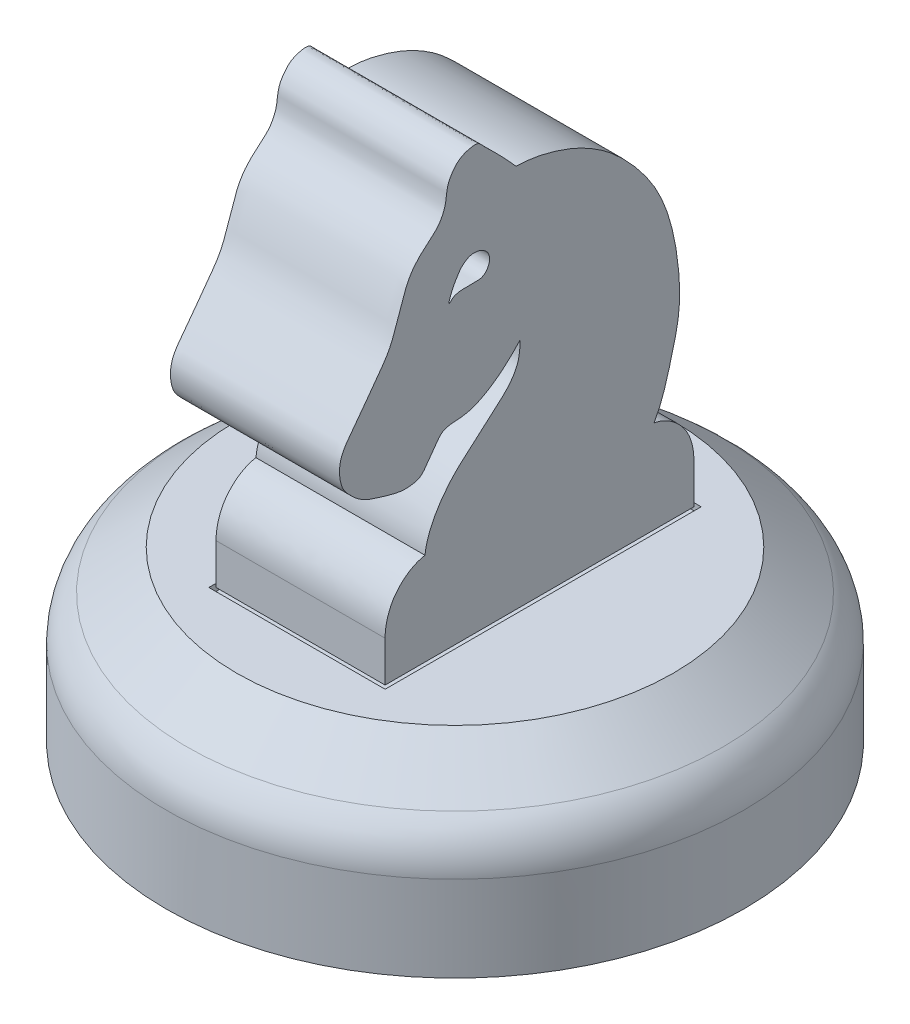
ISO-10303-21;
HEADER;
FILE_DESCRIPTION(('STEP AP214'),'2;1');
FILE_NAME('part.step','',(''),(''),'','','');
FILE_SCHEMA(('AUTOMOTIVE_DESIGN { 1 0 10303 214 1 1 1 1 }'));
ENDSEC;
DATA;
#1=APPLICATION_CONTEXT('core data for automotive mechanical design processes');
#2=APPLICATION_PROTOCOL_DEFINITION('international standard','automotive_design',2000,#1);
#3=PRODUCT_CONTEXT('',#1,'mechanical');
#4=PRODUCT('Part','Part','',(#3));
#5=PRODUCT_RELATED_PRODUCT_CATEGORY('part','',(#4));
#6=PRODUCT_DEFINITION_FORMATION('','',#4);
#7=PRODUCT_DEFINITION_CONTEXT('part definition',#1,'design');
#8=PRODUCT_DEFINITION('design','',#6,#7);
#9=PRODUCT_DEFINITION_SHAPE('','',#8);
#10=(LENGTH_UNIT() NAMED_UNIT(*) SI_UNIT(.MILLI.,.METRE.));
#11=(NAMED_UNIT(*) PLANE_ANGLE_UNIT() SI_UNIT($,.RADIAN.));
#12=(NAMED_UNIT(*) SI_UNIT($,.STERADIAN.) SOLID_ANGLE_UNIT());
#13=UNCERTAINTY_MEASURE_WITH_UNIT(LENGTH_MEASURE(1.E-05),#10,'distance_accuracy_value','');
#14=(GEOMETRIC_REPRESENTATION_CONTEXT(3) GLOBAL_UNCERTAINTY_ASSIGNED_CONTEXT((#13)) GLOBAL_UNIT_ASSIGNED_CONTEXT((#10,
#11,#12)) REPRESENTATION_CONTEXT('',''));
#15=CARTESIAN_POINT('',(0.,0.,0.));
#16=DIRECTION('',(0.,0.,1.));
#17=DIRECTION('',(1.,0.,0.));
#18=AXIS2_PLACEMENT_3D('',#15,#16,#17);
#19=CARTESIAN_POINT('',(4.7625,13.680262783567,8.10185735939134));
#20=DIRECTION('',(1.,0.,0.));
#21=DIRECTION('',(0.,0.,-1.));
#22=AXIS2_PLACEMENT_3D('',#19,#20,#21);
#23=PLANE('',#22);
#24=DIRECTION('',(0.,-1.,0.));
#25=VECTOR('',#24,1.);
#26=CARTESIAN_POINT('',(4.7625,9.525,8.6995));
#27=LINE('',#26,#25);
#28=CARTESIAN_POINT('',(4.7625,11.811,8.6995));
#29=VERTEX_POINT('',#28);
#30=CARTESIAN_POINT('',(4.7625,9.525,8.6995));
#31=VERTEX_POINT('',#30);
#32=EDGE_CURVE('E188',#29,#31,#27,.T.);
#33=ORIENTED_EDGE('',*,*,#32,.T.);
#34=DIRECTION('',(0.,0.,-1.));
#35=VECTOR('',#34,1.);
#36=CARTESIAN_POINT('',(4.7625,9.525,8.6995));
#37=LINE('',#36,#35);
#38=CARTESIAN_POINT('',(4.7625,9.525,-8.6995));
#39=VERTEX_POINT('',#38);
#40=EDGE_CURVE('E107',#31,#39,#37,.T.);
#41=ORIENTED_EDGE('',*,*,#40,.T.);
#42=DIRECTION('',(0.,1.,0.));
#43=VECTOR('',#42,1.);
#44=CARTESIAN_POINT('',(4.7625,9.525,-8.6995));
#45=LINE('',#44,#43);
#46=CARTESIAN_POINT('',(4.7625,11.811,-8.6995));
#47=VERTEX_POINT('',#46);
#48=EDGE_CURVE('E182',#39,#47,#45,.T.);
#49=ORIENTED_EDGE('',*,*,#48,.T.);
#50=CARTESIAN_POINT('',(4.7625,11.811,-8.6995));
#51=CARTESIAN_POINT('',(4.7625,11.9815961923143,-8.6995));
#52=CARTESIAN_POINT('',(4.7625,12.3664028911852,-8.67268212158395));
#53=CARTESIAN_POINT('',(4.7625,12.9064775592162,-8.52854866214895));
#54=CARTESIAN_POINT('',(4.7625,13.451955456764,-8.28386065244339));
#55=CARTESIAN_POINT('',(4.7625,14.2087504776773,-7.70489167117968));
#56=CARTESIAN_POINT('',(4.7625,14.6403347608002,-7.02156279420086));
#57=CARTESIAN_POINT('',(4.7625,14.7379537831052,-6.45515120216595));
#58=B_SPLINE_CURVE_WITH_KNOTS('',3,(#50,#51,#52,#53,#54,#55,#56,#57),.UNSPECIFIED.,.F.,.F.,(4,1,
1,1,1,4),(0.,0.128233990164805,0.288855325655213,0.417856800573254,0.575529242566264,1.),.UNSPECIFIED.);
#59=CARTESIAN_POINT('',(4.7625,14.7379537831052,-6.45515120216595));
#60=VERTEX_POINT('',#59);
#61=EDGE_CURVE('E174',#47,#60,#58,.T.);
#62=ORIENTED_EDGE('',*,*,#61,.T.);
#63=CARTESIAN_POINT('',(4.7625,14.7379537831052,-6.45515120216595));
#64=CARTESIAN_POINT('',(4.7625,15.5347916018253,-6.9072620120768));
#65=CARTESIAN_POINT('',(4.7625,17.1101019740375,-7.34079514012189));
#66=CARTESIAN_POINT('',(4.7625,19.4480811595958,-7.96599147797506));
#67=CARTESIAN_POINT('',(4.7625,21.5772855386648,-7.86645750943055));
#68=CARTESIAN_POINT('',(4.7625,23.4518934582812,-7.56723246801266));
#69=CARTESIAN_POINT('',(4.7625,24.986345257311,-7.11555121839741));
#70=CARTESIAN_POINT('',(4.7625,26.4436945704068,-6.41887229237447));
#71=CARTESIAN_POINT('',(4.7625,27.8375203593776,-5.37923603258682));
#72=CARTESIAN_POINT('',(4.7625,29.2202358296838,-4.02108903850162));
#73=CARTESIAN_POINT('',(4.7625,30.2418776267701,-2.42109382286231));
#74=CARTESIAN_POINT('',(4.7625,30.9170736598921,-0.615022309664148));
#75=CARTESIAN_POINT('',(4.7625,31.1431076052662,0.631432852208959));
#76=CARTESIAN_POINT('',(4.7625,31.1487973226437,1.31786095725713));
#77=B_SPLINE_CURVE_WITH_KNOTS('',3,(#63,#64,#65,#66,#67,#68,#69,#70,#71,#72,#73,#74,#75,#76),
.UNSPECIFIED.,.F.,.F.,(4,1,1,1,1,1,1,1,1,1,1,4),(0.,0.126007373067254,0.227672467983957,
0.334593320710156,0.419280454598045,0.491973595792967,0.556390973249089,0.643086331897103,
0.732789512617551,0.824947916326929,0.904682993600365,1.),.UNSPECIFIED.);
#78=CARTESIAN_POINT('',(4.7625,31.1487973226437,1.31786095725713));
#79=VERTEX_POINT('',#78);
#80=EDGE_CURVE('E126',#60,#79,#77,.T.);
#81=ORIENTED_EDGE('',*,*,#80,.T.);
#82=CARTESIAN_POINT('',(4.7625,31.1487973226437,1.31786095725713));
#83=CARTESIAN_POINT('',(4.7625,31.3019539348354,1.45730049804001));
#84=CARTESIAN_POINT('',(4.7625,31.5916483646961,1.71945064919034));
#85=CARTESIAN_POINT('',(4.7625,32.0339251377226,2.12254258440014));
#86=CARTESIAN_POINT('',(4.7625,32.4196440870442,2.52092241210094));
#87=CARTESIAN_POINT('',(4.7625,32.7987952576809,2.89165676870557));
#88=CARTESIAN_POINT('',(4.7625,33.0718995845694,3.18261460187202));
#89=CARTESIAN_POINT('',(4.7625,33.3918119300108,3.45651904952485));
#90=CARTESIAN_POINT('',(4.7625,33.3460595804598,3.85969832162765));
#91=CARTESIAN_POINT('',(4.7625,33.2406253004543,4.22418115934891));
#92=CARTESIAN_POINT('',(4.7625,33.0714744992397,4.56187923221866));
#93=CARTESIAN_POINT('',(4.7625,32.7397376417843,4.85282466889233));
#94=CARTESIAN_POINT('',(4.7625,32.3233214539465,5.13371688084466));
#95=CARTESIAN_POINT('',(4.7625,31.7778308318256,5.2492641494817));
#96=CARTESIAN_POINT('',(4.7625,31.2653014281355,5.28305110750728));
#97=CARTESIAN_POINT('',(4.7625,30.8254634824363,5.46526160709992));
#98=CARTESIAN_POINT('',(4.7625,30.4120679447406,5.69606919114635));
#99=CARTESIAN_POINT('',(4.7625,30.0233837216251,6.13198260016487));
#100=CARTESIAN_POINT('',(4.7625,29.58447749268,6.66656239494976));
#101=CARTESIAN_POINT('',(4.7625,29.0694104150552,7.13500986450126));
#102=CARTESIAN_POINT('',(4.7625,28.4591601352961,7.49196972547366));
#103=CARTESIAN_POINT('',(4.7625,27.6783731865673,7.75326363201573));
#104=CARTESIAN_POINT('',(4.7625,26.7447160773661,8.0786048897184));
#105=CARTESIAN_POINT('',(4.7625,25.6576345659822,8.47293069308954));
#106=CARTESIAN_POINT('',(4.7625,24.60695120243,9.27769962639));
#107=CARTESIAN_POINT('',(4.7625,23.6433822269488,9.95593836350496));
#108=CARTESIAN_POINT('',(4.7625,22.7146203346543,10.670082220103));
#109=CARTESIAN_POINT('',(4.7625,21.8693039695622,11.309327348714));
#110=CARTESIAN_POINT('',(4.7625,20.8989819068334,11.2884547003213));
#111=CARTESIAN_POINT('',(4.7625,20.2218415586761,11.0741872670407));
#112=CARTESIAN_POINT('',(4.7625,19.8212324440838,10.7307904437454));
#113=CARTESIAN_POINT('',(4.7625,19.3936747980264,10.2834904058553));
#114=CARTESIAN_POINT('',(4.7625,19.0533612219154,9.7160877020694));
#115=CARTESIAN_POINT('',(4.7625,18.8258930334863,8.99799387422308));
#116=CARTESIAN_POINT('',(4.7625,18.653276271082,8.38900127299677));
#117=CARTESIAN_POINT('',(4.7625,18.5080892643669,7.74067788544095));
#118=CARTESIAN_POINT('',(4.7625,18.5167644688039,7.26091311616883));
#119=CARTESIAN_POINT('',(4.7625,18.6203424372546,6.84307431844907));
#120=CARTESIAN_POINT('',(4.7625,18.7688583852471,6.62521992602052));
#121=CARTESIAN_POINT('',(4.7625,18.9784827417534,6.44718649876644));
#122=CARTESIAN_POINT('',(4.7625,19.276534866618,6.25139804487029));
#123=CARTESIAN_POINT('',(4.7625,19.5888657127173,6.03115202876769));
#124=CARTESIAN_POINT('',(4.7625,19.9439760955313,5.77397263662202));
#125=CARTESIAN_POINT('',(4.7625,20.2863734926147,5.50734482016748));
#126=CARTESIAN_POINT('',(4.7625,20.4245643735899,5.02198912619642));
#127=CARTESIAN_POINT('',(4.7625,20.4241354600657,4.45032303542215));
#128=CARTESIAN_POINT('',(4.7625,20.5658541445792,3.75446304575918));
#129=CARTESIAN_POINT('',(4.7625,20.8927489051511,3.08791812469143));
#130=CARTESIAN_POINT('',(4.7625,21.4895068352595,2.15763469778238));
#131=CARTESIAN_POINT('',(4.7625,22.095248332157,1.52424191195429));
#132=CARTESIAN_POINT('',(4.7625,22.5542260915944,1.10611662472741));
#133=B_SPLINE_CURVE_WITH_KNOTS('',3,(#82,#83,#84,#85,#86,#87,#88,#89,#90,#91,#92,#93,#94,#95,
#96,#97,#98,#99,#100,#101,#102,#103,#104,#105,#106,#107,#108,#109,#110,#111,#112,#113,#114,#115,
#116,#117,#118,#119,#120,#121,#122,#123,#124,#125,#126,#127,#128,#129,#130,#131,#132),
.UNSPECIFIED.,.F.,.F.,(4,1,1,1,1,1,1,1,1,1,1,1,1,1,1,1,1,1,1,1,1,1,1,1,1,1,1,1,1,1,1,1,1,1,1,1,
1,1,1,1,1,1,1,1,1,1,1,1,4),(0.,0.0200285013306857,0.0378013132698523,0.0578347683022131,
0.0737149460717673,0.0888621925596499,0.0970547922181342,0.112617960896865,0.123059195197901,
0.134757664060357,0.148235409207326,0.165302201936764,0.182701414375231,0.201371334421468,
0.214662711055314,0.228355299492923,0.246798942162103,0.270468225403544,0.295484215537379,
0.313575639667433,0.338434845961959,0.374813003705989,0.409524434716514,0.449363327622569,
0.501847178188648,0.523473875222212,0.563305662334159,0.600627468565589,0.611504704924638,
0.631603453699679,0.650438857968825,0.671472559329384,0.694788305552869,0.72306459099666,
0.732740737033354,0.758962592426231,0.768667896917222,0.773745680506905,0.784195553559758,
0.79498839276868,0.808300877575605,0.821026305357643,0.837861595072931,0.848300254108209,
0.868397558300759,0.893257253257513,0.916056330819442,0.939814835257287,1.),.UNSPECIFIED.);
#134=CARTESIAN_POINT('',(4.7625,22.5542260915944,1.10611662472741));
#135=VERTEX_POINT('',#134);
#136=EDGE_CURVE('E120',#79,#135,#133,.T.);
#137=ORIENTED_EDGE('',*,*,#136,.T.);
#138=CARTESIAN_POINT('',(4.7625,22.5542260915944,1.10611662472741));
#139=CARTESIAN_POINT('',(4.7625,22.2131253799065,1.09648964800483));
#140=CARTESIAN_POINT('',(4.7625,21.6496468955946,1.12638893104751));
#141=CARTESIAN_POINT('',(4.7625,20.9781166465928,1.47595846530786));
#142=CARTESIAN_POINT('',(4.7625,20.3939968393132,1.94038289383728));
#143=CARTESIAN_POINT('',(4.7625,19.6923521136648,2.77931915192104));
#144=CARTESIAN_POINT('',(4.7625,18.8940429093478,3.66084665280636));
#145=CARTESIAN_POINT('',(4.7625,17.8972255421681,4.84281215205144));
#146=CARTESIAN_POINT('',(4.7625,16.6148240678941,5.88737462386131));
#147=CARTESIAN_POINT('',(4.7625,15.3671193281076,6.3837177201072));
#148=CARTESIAN_POINT('',(4.7625,14.7379537831052,6.45515120216595));
#149=B_SPLINE_CURVE_WITH_KNOTS('',3,(#138,#139,#140,#141,#142,#143,#144,#145,#146,#147,#148),
.UNSPECIFIED.,.F.,.F.,(4,1,1,1,1,1,1,1,4),(0.,0.105970750134368,0.167070244546414,
0.229152258300758,0.333775591942745,0.501080945363479,0.594140792573538,0.807741902537396,1.),.UNSPECIFIED.);
#150=CARTESIAN_POINT('',(4.7625,14.7379537831052,6.45515120216595));
#151=VERTEX_POINT('',#150);
#152=EDGE_CURVE('E124',#135,#151,#149,.T.);
#153=ORIENTED_EDGE('',*,*,#152,.T.);
#154=CARTESIAN_POINT('',(4.7625,14.7379537831052,6.45515120216595));
#155=CARTESIAN_POINT('',(4.7625,14.6403347608002,7.02156279420086));
#156=CARTESIAN_POINT('',(4.7625,14.2087504776772,7.70489167117969));
#157=CARTESIAN_POINT('',(4.7625,13.451955456764,8.28386065244339));
#158=CARTESIAN_POINT('',(4.7625,12.9064775592162,8.52854866214895));
#159=CARTESIAN_POINT('',(4.7625,12.3664028911852,8.67268212158395));
#160=CARTESIAN_POINT('',(4.7625,11.9815961923143,8.6995));
#161=CARTESIAN_POINT('',(4.7625,11.811,8.6995));
#162=B_SPLINE_CURVE_WITH_KNOTS('',3,(#154,#155,#156,#157,#158,#159,#160,#161),.UNSPECIFIED.,.F.,
.F.,(4,1,1,1,1,4),(0.,0.424470757433736,0.582143199426746,0.711144674344787,0.871766009835195,
1.),.UNSPECIFIED.);
#163=EDGE_CURVE('E64',#151,#29,#162,.T.);
#164=ORIENTED_EDGE('',*,*,#163,.T.);
#165=EDGE_LOOP('',(#33,#41,#49,#62,#81,#137,#153,#164));
#166=FACE_BOUND('',#165,.T.);
#167=CARTESIAN_POINT('',(4.7625,26.3388988766511,5.08617017560119));
#168=CARTESIAN_POINT('',(4.7625,26.3483995760784,5.05185816319176));
#169=CARTESIAN_POINT('',(4.7625,26.4831045083582,4.93271466574575));
#170=CARTESIAN_POINT('',(4.7625,26.5840300403057,4.7483450621545));
#171=CARTESIAN_POINT('',(4.7625,26.662879880077,4.42967293283595));
#172=CARTESIAN_POINT('',(4.7625,26.6412567644405,4.02395765693448));
#173=CARTESIAN_POINT('',(4.7625,26.6460619243882,3.63395203071275));
#174=CARTESIAN_POINT('',(4.7625,26.6568112403724,3.32276074456051));
#175=CARTESIAN_POINT('',(4.7625,26.7717474415305,3.08688608467086));
#176=CARTESIAN_POINT('',(4.7625,26.9604273950743,2.93579771919843));
#177=CARTESIAN_POINT('',(4.7625,27.1671363718712,2.82667940769507));
#178=CARTESIAN_POINT('',(4.7625,27.411587188444,2.80113211917649));
#179=CARTESIAN_POINT('',(4.7625,27.6537811085069,2.85307486280875));
#180=CARTESIAN_POINT('',(4.7625,27.8429114567317,3.00066030420355));
#181=CARTESIAN_POINT('',(4.7625,27.9888023740051,3.1767734058697));
#182=CARTESIAN_POINT('',(4.7625,28.0789963178476,3.39949872033269));
#183=CARTESIAN_POINT('',(4.7625,28.1164637771991,3.65127377386429));
#184=CARTESIAN_POINT('',(4.7625,28.0897034965547,3.94412895023011));
#185=CARTESIAN_POINT('',(4.7625,27.9337546783365,4.21099239793935));
#186=CARTESIAN_POINT('',(4.7625,27.7278682510043,4.44499410641345));
#187=CARTESIAN_POINT('',(4.7625,27.460033775197,4.61845709624444));
#188=CARTESIAN_POINT('',(4.7625,27.1345838269302,4.8162389271877));
#189=CARTESIAN_POINT('',(4.7625,26.8493073414952,4.95570050393066));
#190=CARTESIAN_POINT('',(4.7625,26.3208648740321,5.15130042484097));
#191=CARTESIAN_POINT('',(4.7625,26.3388988766511,5.08617017560119));
#192=B_SPLINE_CURVE_WITH_KNOTS('',3,(#167,#168,#169,#170,#171,#172,#173,#174,#175,#176,#177,
#178,#179,#180,#181,#182,#183,#184,#185,#186,#187,#188,#189,#190,#191),.UNSPECIFIED.,.T.,.F.,(4,
1,1,1,1,1,1,1,1,1,1,1,1,1,1,1,1,1,1,1,1,1,4),(0.,0.0376761457665458,0.0555163401210343,
0.103904133388575,0.184310142197023,0.245367846033381,0.285824881718788,0.328299460197946,
0.362294770441984,0.397084060775239,0.435791870679061,0.474404445258391,0.509262158340571,
0.54539207058665,0.579953507985603,0.619659858056652,0.663361880045701,0.713892917119672,
0.760702485225998,0.807081634789745,0.863624654351297,0.928484032504755,1.),.UNSPECIFIED.);
#193=CARTESIAN_POINT('',(4.7625,26.3388988766511,5.08617017560119));
#194=VERTEX_POINT('',#193);
#195=EDGE_CURVE('E195',#194,#194,#192,.T.);
#196=ORIENTED_EDGE('',*,*,#195,.F.);
#197=EDGE_LOOP('',(#196));
#198=FACE_BOUND('',#197,.T.);
#199=ADVANCED_FACE('F47',(#166,#198),#23,.T.);
#200=CARTESIAN_POINT('',(-4.7625,13.680262783567,8.10185735939134));
#201=DIRECTION('',(1.,0.,0.));
#202=DIRECTION('',(0.,0.,-1.));
#203=AXIS2_PLACEMENT_3D('',#200,#201,#202);
#204=PLANE('',#203);
#205=DIRECTION('',(0.,-1.,0.));
#206=VECTOR('',#205,1.);
#207=CARTESIAN_POINT('',(-4.7625,9.525,8.6995));
#208=LINE('',#207,#206);
#209=CARTESIAN_POINT('',(-4.7625,11.811,8.6995));
#210=VERTEX_POINT('',#209);
#211=CARTESIAN_POINT('',(-4.7625,9.525,8.6995));
#212=VERTEX_POINT('',#211);
#213=EDGE_CURVE('E203',#210,#212,#208,.T.);
#214=ORIENTED_EDGE('',*,*,#213,.F.);
#215=CARTESIAN_POINT('',(-4.7625,14.7379537831052,6.45515120216595));
#216=CARTESIAN_POINT('',(-4.7625,14.6403347608002,7.02156279420086));
#217=CARTESIAN_POINT('',(-4.7625,14.2087504776772,7.70489167117969));
#218=CARTESIAN_POINT('',(-4.7625,13.451955456764,8.28386065244339));
#219=CARTESIAN_POINT('',(-4.7625,12.9064775592162,8.52854866214895));
#220=CARTESIAN_POINT('',(-4.7625,12.3664028911852,8.67268212158395));
#221=CARTESIAN_POINT('',(-4.7625,11.9815961923143,8.6995));
#222=CARTESIAN_POINT('',(-4.7625,11.811,8.6995));
#223=B_SPLINE_CURVE_WITH_KNOTS('',3,(#215,#216,#217,#218,#219,#220,#221,#222),.UNSPECIFIED.,.F.,
.F.,(4,1,1,1,1,4),(0.,0.424470757433736,0.582143199426746,0.711144674344787,0.871766009835195,
1.),.UNSPECIFIED.);
#224=CARTESIAN_POINT('',(-4.7625,14.7379537831052,6.45515120216595));
#225=VERTEX_POINT('',#224);
#226=EDGE_CURVE('E99',#225,#210,#223,.T.);
#227=ORIENTED_EDGE('',*,*,#226,.F.);
#228=CARTESIAN_POINT('',(-4.7625,22.5542260915944,1.10611662472741));
#229=CARTESIAN_POINT('',(-4.7625,22.2131253799065,1.09648964800483));
#230=CARTESIAN_POINT('',(-4.7625,21.6496468955946,1.12638893104751));
#231=CARTESIAN_POINT('',(-4.7625,20.9781166465928,1.47595846530786));
#232=CARTESIAN_POINT('',(-4.7625,20.3939968393132,1.94038289383728));
#233=CARTESIAN_POINT('',(-4.7625,19.6923521136648,2.77931915192104));
#234=CARTESIAN_POINT('',(-4.7625,18.8940429093478,3.66084665280636));
#235=CARTESIAN_POINT('',(-4.7625,17.8972255421681,4.84281215205144));
#236=CARTESIAN_POINT('',(-4.7625,16.6148240678941,5.88737462386131));
#237=CARTESIAN_POINT('',(-4.7625,15.3671193281076,6.3837177201072));
#238=CARTESIAN_POINT('',(-4.7625,14.7379537831052,6.45515120216595));
#239=B_SPLINE_CURVE_WITH_KNOTS('',3,(#228,#229,#230,#231,#232,#233,#234,#235,#236,#237,#238),
.UNSPECIFIED.,.F.,.F.,(4,1,1,1,1,1,1,1,4),(0.,0.105970750134368,0.167070244546414,
0.229152258300758,0.333775591942745,0.501080945363479,0.594140792573538,0.807741902537396,1.),.UNSPECIFIED.);
#240=CARTESIAN_POINT('',(-4.7625,22.5542260915944,1.10611662472741));
#241=VERTEX_POINT('',#240);
#242=EDGE_CURVE('E93',#241,#225,#239,.T.);
#243=ORIENTED_EDGE('',*,*,#242,.F.);
#244=CARTESIAN_POINT('',(-4.7625,31.1487973226437,1.31786095725713));
#245=CARTESIAN_POINT('',(-4.7625,31.3019539348354,1.45730049804001));
#246=CARTESIAN_POINT('',(-4.7625,31.5916483646961,1.71945064919034));
#247=CARTESIAN_POINT('',(-4.7625,32.0339251377226,2.12254258440014));
#248=CARTESIAN_POINT('',(-4.7625,32.4196440870442,2.52092241210094));
#249=CARTESIAN_POINT('',(-4.7625,32.7987952576809,2.89165676870557));
#250=CARTESIAN_POINT('',(-4.7625,33.0718995845694,3.18261460187202));
#251=CARTESIAN_POINT('',(-4.7625,33.3918119300108,3.45651904952485));
#252=CARTESIAN_POINT('',(-4.7625,33.3460595804598,3.85969832162765));
#253=CARTESIAN_POINT('',(-4.7625,33.2406253004543,4.22418115934891));
#254=CARTESIAN_POINT('',(-4.7625,33.0714744992397,4.56187923221866));
#255=CARTESIAN_POINT('',(-4.7625,32.7397376417843,4.85282466889233));
#256=CARTESIAN_POINT('',(-4.7625,32.3233214539465,5.13371688084466));
#257=CARTESIAN_POINT('',(-4.7625,31.7778308318256,5.2492641494817));
#258=CARTESIAN_POINT('',(-4.7625,31.2653014281355,5.28305110750728));
#259=CARTESIAN_POINT('',(-4.7625,30.8254634824363,5.46526160709992));
#260=CARTESIAN_POINT('',(-4.7625,30.4120679447406,5.69606919114635));
#261=CARTESIAN_POINT('',(-4.7625,30.0233837216251,6.13198260016487));
#262=CARTESIAN_POINT('',(-4.7625,29.58447749268,6.66656239494976));
#263=CARTESIAN_POINT('',(-4.7625,29.0694104150552,7.13500986450126));
#264=CARTESIAN_POINT('',(-4.7625,28.4591601352961,7.49196972547366));
#265=CARTESIAN_POINT('',(-4.7625,27.6783731865673,7.75326363201573));
#266=CARTESIAN_POINT('',(-4.7625,26.7447160773661,8.0786048897184));
#267=CARTESIAN_POINT('',(-4.7625,25.6576345659822,8.47293069308954));
#268=CARTESIAN_POINT('',(-4.7625,24.60695120243,9.27769962639));
#269=CARTESIAN_POINT('',(-4.7625,23.6433822269488,9.95593836350496));
#270=CARTESIAN_POINT('',(-4.7625,22.7146203346543,10.670082220103));
#271=CARTESIAN_POINT('',(-4.7625,21.8693039695622,11.309327348714));
#272=CARTESIAN_POINT('',(-4.7625,20.8989819068334,11.2884547003213));
#273=CARTESIAN_POINT('',(-4.7625,20.2218415586761,11.0741872670407));
#274=CARTESIAN_POINT('',(-4.7625,19.8212324440838,10.7307904437454));
#275=CARTESIAN_POINT('',(-4.7625,19.3936747980264,10.2834904058553));
#276=CARTESIAN_POINT('',(-4.7625,19.0533612219154,9.7160877020694));
#277=CARTESIAN_POINT('',(-4.7625,18.8258930334863,8.99799387422308));
#278=CARTESIAN_POINT('',(-4.7625,18.653276271082,8.38900127299677));
#279=CARTESIAN_POINT('',(-4.7625,18.5080892643669,7.74067788544095));
#280=CARTESIAN_POINT('',(-4.7625,18.5167644688039,7.26091311616883));
#281=CARTESIAN_POINT('',(-4.7625,18.6203424372546,6.84307431844907));
#282=CARTESIAN_POINT('',(-4.7625,18.7688583852471,6.62521992602052));
#283=CARTESIAN_POINT('',(-4.7625,18.9784827417534,6.44718649876644));
#284=CARTESIAN_POINT('',(-4.7625,19.276534866618,6.25139804487029));
#285=CARTESIAN_POINT('',(-4.7625,19.5888657127173,6.03115202876769));
#286=CARTESIAN_POINT('',(-4.7625,19.9439760955313,5.77397263662202));
#287=CARTESIAN_POINT('',(-4.7625,20.2863734926147,5.50734482016748));
#288=CARTESIAN_POINT('',(-4.7625,20.4245643735899,5.02198912619642));
#289=CARTESIAN_POINT('',(-4.7625,20.4241354600657,4.45032303542215));
#290=CARTESIAN_POINT('',(-4.7625,20.5658541445792,3.75446304575918));
#291=CARTESIAN_POINT('',(-4.7625,20.8927489051511,3.08791812469143));
#292=CARTESIAN_POINT('',(-4.7625,21.4895068352595,2.15763469778238));
#293=CARTESIAN_POINT('',(-4.7625,22.095248332157,1.52424191195429));
#294=CARTESIAN_POINT('',(-4.7625,22.5542260915944,1.10611662472741));
#295=B_SPLINE_CURVE_WITH_KNOTS('',3,(#244,#245,#246,#247,#248,#249,#250,#251,#252,#253,#254,
#255,#256,#257,#258,#259,#260,#261,#262,#263,#264,#265,#266,#267,#268,#269,#270,#271,#272,#273,
#274,#275,#276,#277,#278,#279,#280,#281,#282,#283,#284,#285,#286,#287,#288,#289,#290,#291,#292,
#293,#294),.UNSPECIFIED.,.F.,.F.,(4,1,1,1,1,1,1,1,1,1,1,1,1,1,1,1,1,1,1,1,1,1,1,1,1,1,1,1,1,1,1,
1,1,1,1,1,1,1,1,1,1,1,1,1,1,1,1,1,4),(0.,0.0200285013306857,0.0378013132698523,
0.0578347683022131,0.0737149460717673,0.0888621925596499,0.0970547922181342,0.112617960896865,
0.123059195197901,0.134757664060357,0.148235409207326,0.165302201936764,0.182701414375231,
0.201371334421468,0.214662711055314,0.228355299492923,0.246798942162103,0.270468225403544,
0.295484215537379,0.313575639667433,0.338434845961959,0.374813003705989,0.409524434716514,
0.449363327622569,0.501847178188648,0.523473875222212,0.563305662334159,0.600627468565589,
0.611504704924638,0.631603453699679,0.650438857968825,0.671472559329384,0.694788305552869,
0.72306459099666,0.732740737033354,0.758962592426231,0.768667896917222,0.773745680506905,
0.784195553559758,0.79498839276868,0.808300877575605,0.821026305357643,0.837861595072931,
0.848300254108209,0.868397558300759,0.893257253257513,0.916056330819442,0.939814835257287,1.),.UNSPECIFIED.);
#296=CARTESIAN_POINT('',(-4.7625,31.1487973226437,1.31786095725713));
#297=VERTEX_POINT('',#296);
#298=EDGE_CURVE('E134',#297,#241,#295,.T.);
#299=ORIENTED_EDGE('',*,*,#298,.F.);
#300=CARTESIAN_POINT('',(-4.7625,14.7379537831052,-6.45515120216595));
#301=CARTESIAN_POINT('',(-4.7625,15.5347916018253,-6.9072620120768));
#302=CARTESIAN_POINT('',(-4.7625,17.1101019740375,-7.34079514012189));
#303=CARTESIAN_POINT('',(-4.7625,19.4480811595958,-7.96599147797506));
#304=CARTESIAN_POINT('',(-4.7625,21.5772855386648,-7.86645750943055));
#305=CARTESIAN_POINT('',(-4.7625,23.4518934582812,-7.56723246801266));
#306=CARTESIAN_POINT('',(-4.7625,24.986345257311,-7.11555121839741));
#307=CARTESIAN_POINT('',(-4.7625,26.4436945704068,-6.41887229237447));
#308=CARTESIAN_POINT('',(-4.7625,27.8375203593776,-5.37923603258682));
#309=CARTESIAN_POINT('',(-4.7625,29.2202358296838,-4.02108903850162));
#310=CARTESIAN_POINT('',(-4.7625,30.2418776267701,-2.42109382286231));
#311=CARTESIAN_POINT('',(-4.7625,30.9170736598921,-0.615022309664148));
#312=CARTESIAN_POINT('',(-4.7625,31.1431076052662,0.631432852208959));
#313=CARTESIAN_POINT('',(-4.7625,31.1487973226437,1.31786095725713));
#314=B_SPLINE_CURVE_WITH_KNOTS('',3,(#300,#301,#302,#303,#304,#305,#306,#307,#308,#309,#310,
#311,#312,#313),.UNSPECIFIED.,.F.,.F.,(4,1,1,1,1,1,1,1,1,1,1,4),(0.,0.126007373067254,
0.227672467983957,0.334593320710156,0.419280454598045,0.491973595792967,0.556390973249089,
0.643086331897103,0.732789512617551,0.824947916326929,0.904682993600365,1.),.UNSPECIFIED.);
#315=CARTESIAN_POINT('',(-4.7625,14.7379537831052,-6.45515120216595));
#316=VERTEX_POINT('',#315);
#317=EDGE_CURVE('E237',#316,#297,#314,.T.);
#318=ORIENTED_EDGE('',*,*,#317,.F.);
#319=CARTESIAN_POINT('',(-4.7625,11.811,-8.6995));
#320=CARTESIAN_POINT('',(-4.7625,11.9815961923143,-8.6995));
#321=CARTESIAN_POINT('',(-4.7625,12.3664028911852,-8.67268212158395));
#322=CARTESIAN_POINT('',(-4.7625,12.9064775592162,-8.52854866214895));
#323=CARTESIAN_POINT('',(-4.7625,13.451955456764,-8.28386065244339));
#324=CARTESIAN_POINT('',(-4.7625,14.2087504776773,-7.70489167117968));
#325=CARTESIAN_POINT('',(-4.7625,14.6403347608002,-7.02156279420086));
#326=CARTESIAN_POINT('',(-4.7625,14.7379537831052,-6.45515120216595));
#327=B_SPLINE_CURVE_WITH_KNOTS('',3,(#319,#320,#321,#322,#323,#324,#325,#326),.UNSPECIFIED.,.F.,
.F.,(4,1,1,1,1,4),(0.,0.128233990164805,0.288855325655213,0.417856800573254,0.575529242566264,
1.),.UNSPECIFIED.);
#328=CARTESIAN_POINT('',(-4.7625,11.811,-8.6995));
#329=VERTEX_POINT('',#328);
#330=EDGE_CURVE('E233',#329,#316,#327,.T.);
#331=ORIENTED_EDGE('',*,*,#330,.F.);
#332=DIRECTION('',(0.,1.,0.));
#333=VECTOR('',#332,1.);
#334=CARTESIAN_POINT('',(-4.7625,9.525,-8.6995));
#335=LINE('',#334,#333);
#336=CARTESIAN_POINT('',(-4.7625,9.525,-8.6995));
#337=VERTEX_POINT('',#336);
#338=EDGE_CURVE('E229',#337,#329,#335,.T.);
#339=ORIENTED_EDGE('',*,*,#338,.F.);
#340=DIRECTION('',(0.,0.,-1.));
#341=VECTOR('',#340,1.);
#342=CARTESIAN_POINT('',(-4.7625,9.525,8.6995));
#343=LINE('',#342,#341);
#344=EDGE_CURVE('E227',#212,#337,#343,.T.);
#345=ORIENTED_EDGE('',*,*,#344,.F.);
#346=EDGE_LOOP('',(#214,#227,#243,#299,#318,#331,#339,#345));
#347=FACE_BOUND('',#346,.T.);
#348=CARTESIAN_POINT('',(-4.7625,26.3388988766511,5.08617017560119));
#349=CARTESIAN_POINT('',(-4.7625,26.3483995760784,5.05185816319176));
#350=CARTESIAN_POINT('',(-4.7625,26.4831045083582,4.93271466574575));
#351=CARTESIAN_POINT('',(-4.7625,26.5840300403057,4.7483450621545));
#352=CARTESIAN_POINT('',(-4.7625,26.662879880077,4.42967293283595));
#353=CARTESIAN_POINT('',(-4.7625,26.6412567644405,4.02395765693448));
#354=CARTESIAN_POINT('',(-4.7625,26.6460619243882,3.63395203071275));
#355=CARTESIAN_POINT('',(-4.7625,26.6568112403724,3.32276074456051));
#356=CARTESIAN_POINT('',(-4.7625,26.7717474415305,3.08688608467086));
#357=CARTESIAN_POINT('',(-4.7625,26.9604273950743,2.93579771919843));
#358=CARTESIAN_POINT('',(-4.7625,27.1671363718712,2.82667940769507));
#359=CARTESIAN_POINT('',(-4.7625,27.411587188444,2.80113211917649));
#360=CARTESIAN_POINT('',(-4.7625,27.6537811085069,2.85307486280875));
#361=CARTESIAN_POINT('',(-4.7625,27.8429114567317,3.00066030420355));
#362=CARTESIAN_POINT('',(-4.7625,27.9888023740051,3.1767734058697));
#363=CARTESIAN_POINT('',(-4.7625,28.0789963178476,3.39949872033269));
#364=CARTESIAN_POINT('',(-4.7625,28.1164637771991,3.65127377386429));
#365=CARTESIAN_POINT('',(-4.7625,28.0897034965547,3.94412895023011));
#366=CARTESIAN_POINT('',(-4.7625,27.9337546783365,4.21099239793935));
#367=CARTESIAN_POINT('',(-4.7625,27.7278682510043,4.44499410641345));
#368=CARTESIAN_POINT('',(-4.7625,27.460033775197,4.61845709624444));
#369=CARTESIAN_POINT('',(-4.7625,27.1345838269302,4.8162389271877));
#370=CARTESIAN_POINT('',(-4.7625,26.8493073414952,4.95570050393066));
#371=CARTESIAN_POINT('',(-4.7625,26.3208648740321,5.15130042484097));
#372=CARTESIAN_POINT('',(-4.7625,26.3388988766511,5.08617017560119));
#373=B_SPLINE_CURVE_WITH_KNOTS('',3,(#348,#349,#350,#351,#352,#353,#354,#355,#356,#357,#358,
#359,#360,#361,#362,#363,#364,#365,#366,#367,#368,#369,#370,#371,#372),.UNSPECIFIED.,.T.,.F.,(4,
1,1,1,1,1,1,1,1,1,1,1,1,1,1,1,1,1,1,1,1,1,4),(0.,0.0376761457665458,0.0555163401210343,
0.103904133388575,0.184310142197023,0.245367846033381,0.285824881718788,0.328299460197946,
0.362294770441984,0.397084060775239,0.435791870679061,0.474404445258391,0.509262158340571,
0.54539207058665,0.579953507985603,0.619659858056652,0.663361880045701,0.713892917119672,
0.760702485225998,0.807081634789745,0.863624654351297,0.928484032504755,1.),.UNSPECIFIED.);
#374=CARTESIAN_POINT('',(-4.7625,26.3388988766511,5.08617017560119));
#375=VERTEX_POINT('',#374);
#376=EDGE_CURVE('E190',#375,#375,#373,.T.);
#377=ORIENTED_EDGE('',*,*,#376,.T.);
#378=EDGE_LOOP('',(#377));
#379=FACE_BOUND('',#378,.T.);
#380=ADVANCED_FACE('F213',(#347,#379),#204,.F.);
#381=CARTESIAN_POINT('',(4.7625,9.525,8.6995));
#382=DIRECTION('',(0.,0.,-1.));
#383=DIRECTION('',(-1.,0.,0.));
#384=AXIS2_PLACEMENT_3D('',#381,#382,#383);
#385=PLANE('',#384);
#386=ORIENTED_EDGE('',*,*,#213,.T.);
#387=DIRECTION('',(-1.,0.,0.));
#388=VECTOR('',#387,1.);
#389=CARTESIAN_POINT('',(4.7625,9.525,8.6995));
#390=LINE('',#389,#388);
#391=EDGE_CURVE('E12',#31,#212,#390,.T.);
#392=ORIENTED_EDGE('',*,*,#391,.F.);
#393=ORIENTED_EDGE('',*,*,#32,.F.);
#394=DIRECTION('',(-1.,0.,0.));
#395=VECTOR('',#394,1.);
#396=CARTESIAN_POINT('',(4.7625,11.811,8.6995));
#397=LINE('',#396,#395);
#398=EDGE_CURVE('E140',#29,#210,#397,.T.);
#399=ORIENTED_EDGE('',*,*,#398,.T.);
#400=EDGE_LOOP('',(#386,#392,#393,#399));
#401=FACE_BOUND('',#400,.T.);
#402=ADVANCED_FACE('F49',(#401),#385,.F.);
#403=CARTESIAN_POINT('',(4.7625,9.525,8.6995));
#404=DIRECTION('',(0.,1.,0.));
#405=DIRECTION('',(0.,0.,1.));
#406=AXIS2_PLACEMENT_3D('',#403,#404,#405);
#407=PLANE('',#406);
#408=ORIENTED_EDGE('',*,*,#344,.T.);
#409=DIRECTION('',(-1.,0.,0.));
#410=VECTOR('',#409,1.);
#411=CARTESIAN_POINT('',(4.7625,9.525,-8.6995));
#412=LINE('',#411,#410);
#413=EDGE_CURVE('E56',#39,#337,#412,.T.);
#414=ORIENTED_EDGE('',*,*,#413,.F.);
#415=ORIENTED_EDGE('',*,*,#40,.F.);
#416=ORIENTED_EDGE('',*,*,#391,.T.);
#417=EDGE_LOOP('',(#408,#414,#415,#416));
#418=FACE_BOUND('',#417,.T.);
#419=ADVANCED_FACE('F219',(#418),#407,.F.);
#420=CARTESIAN_POINT('',(4.7625,9.525,-8.6995));
#421=DIRECTION('',(0.,0.,1.));
#422=DIRECTION('',(1.,0.,0.));
#423=AXIS2_PLACEMENT_3D('',#420,#421,#422);
#424=PLANE('',#423);
#425=ORIENTED_EDGE('',*,*,#338,.T.);
#426=DIRECTION('',(-1.,0.,0.));
#427=VECTOR('',#426,1.);
#428=CARTESIAN_POINT('',(4.7625,11.811,-8.6995));
#429=LINE('',#428,#427);
#430=EDGE_CURVE('E271',#47,#329,#429,.T.);
#431=ORIENTED_EDGE('',*,*,#430,.F.);
#432=ORIENTED_EDGE('',*,*,#48,.F.);
#433=ORIENTED_EDGE('',*,*,#413,.T.);
#434=EDGE_LOOP('',(#425,#431,#432,#433));
#435=FACE_BOUND('',#434,.T.);
#436=ADVANCED_FACE('F276',(#435),#424,.F.);
#437=DIRECTION('',(-1.,0.,0.));
#438=VECTOR('',#437,1.);
#439=SURFACE_OF_LINEAR_EXTRUSION('',#58,#438);
#440=ORIENTED_EDGE('',*,*,#330,.T.);
#441=DIRECTION('',(-1.,0.,0.));
#442=VECTOR('',#441,1.);
#443=CARTESIAN_POINT('',(4.7625,14.7379537831052,-6.45515120216595));
#444=LINE('',#443,#442);
#445=EDGE_CURVE('E268',#60,#316,#444,.T.);
#446=ORIENTED_EDGE('',*,*,#445,.F.);
#447=ORIENTED_EDGE('',*,*,#61,.F.);
#448=ORIENTED_EDGE('',*,*,#430,.T.);
#449=EDGE_LOOP('',(#440,#446,#447,#448));
#450=FACE_BOUND('',#449,.T.);
#451=ADVANCED_FACE('F167',(#450),#439,.F.);
#452=DIRECTION('',(-1.,0.,0.));
#453=VECTOR('',#452,1.);
#454=SURFACE_OF_LINEAR_EXTRUSION('',#77,#453);
#455=ORIENTED_EDGE('',*,*,#317,.T.);
#456=DIRECTION('',(-1.,0.,0.));
#457=VECTOR('',#456,1.);
#458=CARTESIAN_POINT('',(4.7625,31.1487973226437,1.31786095725713));
#459=LINE('',#458,#457);
#460=EDGE_CURVE('E135',#79,#297,#459,.T.);
#461=ORIENTED_EDGE('',*,*,#460,.F.);
#462=ORIENTED_EDGE('',*,*,#80,.F.);
#463=ORIENTED_EDGE('',*,*,#445,.T.);
#464=EDGE_LOOP('',(#455,#461,#462,#463));
#465=FACE_BOUND('',#464,.T.);
#466=ADVANCED_FACE('F164',(#465),#454,.F.);
#467=DIRECTION('',(-1.,0.,0.));
#468=VECTOR('',#467,1.);
#469=SURFACE_OF_LINEAR_EXTRUSION('',#133,#468);
#470=ORIENTED_EDGE('',*,*,#298,.T.);
#471=DIRECTION('',(-1.,0.,0.));
#472=VECTOR('',#471,1.);
#473=CARTESIAN_POINT('',(4.7625,22.5542260915944,1.10611662472741));
#474=LINE('',#473,#472);
#475=EDGE_CURVE('E131',#135,#241,#474,.T.);
#476=ORIENTED_EDGE('',*,*,#475,.F.);
#477=ORIENTED_EDGE('',*,*,#136,.F.);
#478=ORIENTED_EDGE('',*,*,#460,.T.);
#479=EDGE_LOOP('',(#470,#476,#477,#478));
#480=FACE_BOUND('',#479,.T.);
#481=ADVANCED_FACE('F132',(#480),#469,.F.);
#482=DIRECTION('',(-1.,0.,0.));
#483=VECTOR('',#482,1.);
#484=SURFACE_OF_LINEAR_EXTRUSION('',#149,#483);
#485=ORIENTED_EDGE('',*,*,#242,.T.);
#486=DIRECTION('',(-1.,0.,0.));
#487=VECTOR('',#486,1.);
#488=CARTESIAN_POINT('',(4.7625,14.7379537831052,6.45515120216595));
#489=LINE('',#488,#487);
#490=EDGE_CURVE('E136',#151,#225,#489,.T.);
#491=ORIENTED_EDGE('',*,*,#490,.F.);
#492=ORIENTED_EDGE('',*,*,#152,.F.);
#493=ORIENTED_EDGE('',*,*,#475,.T.);
#494=EDGE_LOOP('',(#485,#491,#492,#493));
#495=FACE_BOUND('',#494,.T.);
#496=ADVANCED_FACE('F138',(#495),#484,.F.);
#497=DIRECTION('',(-1.,0.,0.));
#498=VECTOR('',#497,1.);
#499=SURFACE_OF_LINEAR_EXTRUSION('',#162,#498);
#500=ORIENTED_EDGE('',*,*,#226,.T.);
#501=ORIENTED_EDGE('',*,*,#398,.F.);
#502=ORIENTED_EDGE('',*,*,#163,.F.);
#503=ORIENTED_EDGE('',*,*,#490,.T.);
#504=EDGE_LOOP('',(#500,#501,#502,#503));
#505=FACE_BOUND('',#504,.T.);
#506=ADVANCED_FACE('F160',(#505),#499,.F.);
#507=DIRECTION('',(-1.,0.,0.));
#508=VECTOR('',#507,1.);
#509=SURFACE_OF_LINEAR_EXTRUSION('',#192,#508);
#510=ORIENTED_EDGE('',*,*,#195,.T.);
#511=EDGE_LOOP('',(#510));
#512=FACE_BOUND('',#511,.T.);
#513=ORIENTED_EDGE('',*,*,#376,.F.);
#514=EDGE_LOOP('',(#513));
#515=FACE_BOUND('',#514,.T.);
#516=ADVANCED_FACE('F208',(#512,#515),#509,.T.);
#517=CLOSED_SHELL('',(#199,#380,#402,#419,#436,#451,#466,#481,#496,#506,#516));
#518=MANIFOLD_SOLID_BREP('B2',#517);
#519=CARTESIAN_POINT('',(0.,4.7625,0.));
#520=DIRECTION('',(0.,-1.,0.));
#521=DIRECTION('',(0.,0.,-1.));
#522=AXIS2_PLACEMENT_3D('',#519,#520,#521);
#523=CYLINDRICAL_SURFACE('',#522,2.59079999999997);
#524=CARTESIAN_POINT('',(0.,4.7625,0.));
#525=DIRECTION('',(0.,-1.,0.));
#526=DIRECTION('',(0.,0.,-1.));
#527=AXIS2_PLACEMENT_3D('',#524,#525,#526);
#528=CIRCLE('',#527,2.59079999999999);
#529=CARTESIAN_POINT('',(0.,4.7625,-2.59079999999999));
#530=VERTEX_POINT('',#529);
#531=EDGE_CURVE('E467',#530,#530,#528,.T.);
#532=ORIENTED_EDGE('',*,*,#531,.T.);
#533=EDGE_LOOP('',(#532));
#534=FACE_BOUND('',#533,.T.);
#535=CARTESIAN_POINT('',(0.,9.128125,0.));
#536=DIRECTION('',(0.,1.,0.));
#537=DIRECTION('',(0.,0.,1.));
#538=AXIS2_PLACEMENT_3D('',#535,#536,#537);
#539=CIRCLE('',#538,2.59079999999997);
#540=CARTESIAN_POINT('',(0.,9.128125,2.59079999999997));
#541=VERTEX_POINT('',#540);
#542=EDGE_CURVE('E366',#541,#541,#539,.F.);
#543=ORIENTED_EDGE('',*,*,#542,.F.);
#544=EDGE_LOOP('',(#543));
#545=FACE_BOUND('',#544,.T.);
#546=ADVANCED_FACE('F362',(#534,#545),#523,.F.);
#547=CARTESIAN_POINT('',(0.,6.35,0.));
#548=DIRECTION('',(0.,-1.,0.));
#549=DIRECTION('',(0.,0.,-1.));
#550=AXIS2_PLACEMENT_3D('',#547,#548,#549);
#551=CYLINDRICAL_SURFACE('',#550,16.271875);
#552=CARTESIAN_POINT('',(0.,4.82401610923014,0.));
#553=DIRECTION('',(0.,-1.,0.));
#554=DIRECTION('',(1.,0.,0.));
#555=AXIS2_PLACEMENT_3D('',#552,#553,#554);
#556=CIRCLE('',#555,16.271875);
#557=CARTESIAN_POINT('',(16.271875,4.82401610923014,0.));
#558=VERTEX_POINT('',#557);
#559=EDGE_CURVE('E45',#558,#558,#556,.T.);
#560=ORIENTED_EDGE('',*,*,#559,.T.);
#561=EDGE_LOOP('',(#560));
#562=FACE_BOUND('',#561,.T.);
#563=CARTESIAN_POINT('',(0.,0.,0.));
#564=DIRECTION('',(0.,1.,0.));
#565=DIRECTION('',(0.,0.,1.));
#566=AXIS2_PLACEMENT_3D('',#563,#564,#565);
#567=CIRCLE('',#566,16.271875);
#568=CARTESIAN_POINT('',(0.,0.,16.271875));
#569=VERTEX_POINT('',#568);
#570=EDGE_CURVE('E503',#569,#569,#567,.T.);
#571=ORIENTED_EDGE('',*,*,#570,.T.);
#572=EDGE_LOOP('',(#571));
#573=FACE_BOUND('',#572,.T.);
#574=ADVANCED_FACE('F525',(#562,#573),#551,.T.);
#575=CARTESIAN_POINT('',(0.,0.,0.));
#576=DIRECTION('',(0.,1.,0.));
#577=DIRECTION('',(0.,0.,1.));
#578=AXIS2_PLACEMENT_3D('',#575,#576,#577);
#579=PLANE('',#578);
#580=DIRECTION('',(-1.,0.,0.));
#581=VECTOR('',#580,1.);
#582=CARTESIAN_POINT('',(-6.4516,0.,9.6266));
#583=LINE('',#582,#581);
#584=CARTESIAN_POINT('',(6.4516,0.,9.6266));
#585=VERTEX_POINT('',#584);
#586=CARTESIAN_POINT('',(-6.4516,0.,9.6266));
#587=VERTEX_POINT('',#586);
#588=EDGE_CURVE('E485',#585,#587,#583,.T.);
#589=ORIENTED_EDGE('',*,*,#588,.F.);
#590=DIRECTION('',(0.,0.,1.));
#591=VECTOR('',#590,1.);
#592=CARTESIAN_POINT('',(6.4516,0.,-9.6266));
#593=LINE('',#592,#591);
#594=CARTESIAN_POINT('',(6.4516,0.,-9.6266));
#595=VERTEX_POINT('',#594);
#596=EDGE_CURVE('E386',#595,#585,#593,.T.);
#597=ORIENTED_EDGE('',*,*,#596,.F.);
#598=DIRECTION('',(1.,0.,0.));
#599=VECTOR('',#598,1.);
#600=CARTESIAN_POINT('',(-6.4516,0.,-9.6266));
#601=LINE('',#600,#599);
#602=CARTESIAN_POINT('',(-6.4516,0.,-9.6266));
#603=VERTEX_POINT('',#602);
#604=EDGE_CURVE('E474',#603,#595,#601,.T.);
#605=ORIENTED_EDGE('',*,*,#604,.F.);
#606=DIRECTION('',(0.,0.,-1.));
#607=VECTOR('',#606,1.);
#608=CARTESIAN_POINT('',(-6.4516,0.,-9.6266));
#609=LINE('',#608,#607);
#610=EDGE_CURVE('E488',#587,#603,#609,.T.);
#611=ORIENTED_EDGE('',*,*,#610,.F.);
#612=EDGE_LOOP('',(#589,#597,#605,#611));
#613=FACE_BOUND('',#612,.T.);
#614=ORIENTED_EDGE('',*,*,#570,.F.);
#615=EDGE_LOOP('',(#614));
#616=FACE_BOUND('',#615,.T.);
#617=ADVANCED_FACE('F531',(#613,#616),#579,.F.);
#618=CARTESIAN_POINT('',(-12.303125,9.525,0.));
#619=DIRECTION('',(0.,1.,0.));
#620=DIRECTION('',(-1.,0.,0.));
#621=AXIS2_PLACEMENT_3D('',#618,#619,#620);
#622=PLANE('',#621);
#623=DIRECTION('',(0.,0.,1.));
#624=VECTOR('',#623,1.);
#625=CARTESIAN_POINT('',(-4.9657,9.525,-8.9027));
#626=LINE('',#625,#624);
#627=CARTESIAN_POINT('',(-4.9657,9.525,-8.9027));
#628=VERTEX_POINT('',#627);
#629=CARTESIAN_POINT('',(-4.9657,9.525,8.9027));
#630=VERTEX_POINT('',#629);
#631=EDGE_CURVE('E378',#628,#630,#626,.T.);
#632=ORIENTED_EDGE('',*,*,#631,.F.);
#633=DIRECTION('',(-1.,0.,0.));
#634=VECTOR('',#633,1.);
#635=CARTESIAN_POINT('',(4.9657,9.525,-8.9027));
#636=LINE('',#635,#634);
#637=CARTESIAN_POINT('',(4.9657,9.525,-8.9027));
#638=VERTEX_POINT('',#637);
#639=EDGE_CURVE('E449',#638,#628,#636,.T.);
#640=ORIENTED_EDGE('',*,*,#639,.F.);
#641=DIRECTION('',(0.,0.,-1.));
#642=VECTOR('',#641,1.);
#643=CARTESIAN_POINT('',(4.9657,9.525,8.9027));
#644=LINE('',#643,#642);
#645=CARTESIAN_POINT('',(4.9657,9.525,8.9027));
#646=VERTEX_POINT('',#645);
#647=EDGE_CURVE('E452',#646,#638,#644,.T.);
#648=ORIENTED_EDGE('',*,*,#647,.F.);
#649=DIRECTION('',(1.,0.,0.));
#650=VECTOR('',#649,1.);
#651=CARTESIAN_POINT('',(-4.9657,9.525,8.9027));
#652=LINE('',#651,#650);
#653=EDGE_CURVE('E458',#630,#646,#652,.T.);
#654=ORIENTED_EDGE('',*,*,#653,.F.);
#655=EDGE_LOOP('',(#632,#640,#648,#654));
#656=FACE_BOUND('',#655,.T.);
#657=CARTESIAN_POINT('',(0.,9.525,0.));
#658=DIRECTION('',(0.,1.,0.));
#659=DIRECTION('',(-1.,0.,0.));
#660=AXIS2_PLACEMENT_3D('',#657,#658,#659);
#661=CIRCLE('',#660,12.303125);
#662=CARTESIAN_POINT('',(-12.303125,9.525,0.));
#663=VERTEX_POINT('',#662);
#664=EDGE_CURVE('E495',#663,#663,#661,.T.);
#665=ORIENTED_EDGE('',*,*,#664,.T.);
#666=EDGE_LOOP('',(#665));
#667=FACE_BOUND('',#666,.T.);
#668=ADVANCED_FACE('F521',(#656,#667),#622,.T.);
#669=CARTESIAN_POINT('',(0.,9.525,0.));
#670=DIRECTION('',(0.,-1.,0.));
#671=DIRECTION('',(1.,0.,0.));
#672=AXIS2_PLACEMENT_3D('',#669,#670,#671);
#673=CONICAL_SURFACE('',#672,12.303125,0.896055384571344);
#674=CARTESIAN_POINT('',(0.,7.30327457921176,0.));
#675=DIRECTION('',(0.,-1.,0.));
#676=DIRECTION('',(1.,0.,0.));
#677=AXIS2_PLACEMENT_3D('',#674,#675,#676);
#678=CIRCLE('',#677,15.0802817759853);
#679=CARTESIAN_POINT('',(15.0802817759853,7.30327457921176,0.));
#680=VERTEX_POINT('',#679);
#681=EDGE_CURVE('E371',#680,#680,#678,.F.);
#682=ORIENTED_EDGE('',*,*,#681,.T.);
#683=EDGE_LOOP('',(#682));
#684=FACE_BOUND('',#683,.T.);
#685=ORIENTED_EDGE('',*,*,#664,.F.);
#686=EDGE_LOOP('',(#685));
#687=FACE_BOUND('',#686,.T.);
#688=ADVANCED_FACE('F509',(#684,#687),#673,.T.);
#689=CARTESIAN_POINT('',(0.,4.82401610923014,0.));
#690=DIRECTION('',(0.,-1.,0.));
#691=DIRECTION('',(1.,0.,0.));
#692=AXIS2_PLACEMENT_3D('',#689,#690,#691);
#693=TOROIDAL_SURFACE('',#692,13.096875,3.175);
#694=ORIENTED_EDGE('',*,*,#559,.F.);
#695=EDGE_LOOP('',(#694));
#696=FACE_BOUND('',#695,.T.);
#697=ORIENTED_EDGE('',*,*,#681,.F.);
#698=EDGE_LOOP('',(#697));
#699=FACE_BOUND('',#698,.T.);
#700=ADVANCED_FACE('F364',(#696,#699),#693,.T.);
#701=CARTESIAN_POINT('',(6.4516,4.7625,-9.6266));
#702=DIRECTION('',(1.,0.,0.));
#703=DIRECTION('',(0.,0.,-1.));
#704=AXIS2_PLACEMENT_3D('',#701,#702,#703);
#705=PLANE('',#704);
#706=ORIENTED_EDGE('',*,*,#596,.T.);
#707=DIRECTION('',(0.,-1.,0.));
#708=VECTOR('',#707,1.);
#709=CARTESIAN_POINT('',(6.4516,4.7625,9.6266));
#710=LINE('',#709,#708);
#711=CARTESIAN_POINT('',(6.4516,4.7625,9.6266));
#712=VERTEX_POINT('',#711);
#713=EDGE_CURVE('E483',#712,#585,#710,.T.);
#714=ORIENTED_EDGE('',*,*,#713,.F.);
#715=DIRECTION('',(0.,0.,1.));
#716=VECTOR('',#715,1.);
#717=CARTESIAN_POINT('',(6.4516,4.7625,-9.6266));
#718=LINE('',#717,#716);
#719=CARTESIAN_POINT('',(6.4516,4.7625,-9.6266));
#720=VERTEX_POINT('',#719);
#721=EDGE_CURVE('E470',#720,#712,#718,.T.);
#722=ORIENTED_EDGE('',*,*,#721,.F.);
#723=DIRECTION('',(0.,-1.,0.));
#724=VECTOR('',#723,1.);
#725=CARTESIAN_POINT('',(6.4516,4.7625,-9.6266));
#726=LINE('',#725,#724);
#727=EDGE_CURVE('E493',#720,#595,#726,.T.);
#728=ORIENTED_EDGE('',*,*,#727,.T.);
#729=EDGE_LOOP('',(#706,#714,#722,#728));
#730=FACE_BOUND('',#729,.T.);
#731=ADVANCED_FACE('F513',(#730),#705,.F.);
#732=CARTESIAN_POINT('',(-6.4516,4.7625,-9.6266));
#733=DIRECTION('',(0.,0.,-1.));
#734=DIRECTION('',(-1.,0.,0.));
#735=AXIS2_PLACEMENT_3D('',#732,#733,#734);
#736=PLANE('',#735);
#737=ORIENTED_EDGE('',*,*,#604,.T.);
#738=ORIENTED_EDGE('',*,*,#727,.F.);
#739=DIRECTION('',(1.,0.,0.));
#740=VECTOR('',#739,1.);
#741=CARTESIAN_POINT('',(-6.4516,4.7625,-9.6266));
#742=LINE('',#741,#740);
#743=CARTESIAN_POINT('',(-6.4516,4.7625,-9.6266));
#744=VERTEX_POINT('',#743);
#745=EDGE_CURVE('E480',#744,#720,#742,.T.);
#746=ORIENTED_EDGE('',*,*,#745,.F.);
#747=DIRECTION('',(0.,-1.,0.));
#748=VECTOR('',#747,1.);
#749=CARTESIAN_POINT('',(-6.4516,4.7625,-9.6266));
#750=LINE('',#749,#748);
#751=EDGE_CURVE('E496',#744,#603,#750,.T.);
#752=ORIENTED_EDGE('',*,*,#751,.T.);
#753=EDGE_LOOP('',(#737,#738,#746,#752));
#754=FACE_BOUND('',#753,.T.);
#755=ADVANCED_FACE('F519',(#754),#736,.F.);
#756=CARTESIAN_POINT('',(-6.4516,4.7625,-9.6266));
#757=DIRECTION('',(-1.,0.,0.));
#758=DIRECTION('',(0.,0.,1.));
#759=AXIS2_PLACEMENT_3D('',#756,#757,#758);
#760=PLANE('',#759);
#761=ORIENTED_EDGE('',*,*,#610,.T.);
#762=ORIENTED_EDGE('',*,*,#751,.F.);
#763=DIRECTION('',(0.,0.,-1.));
#764=VECTOR('',#763,1.);
#765=CARTESIAN_POINT('',(-6.4516,4.7625,-9.6266));
#766=LINE('',#765,#764);
#767=CARTESIAN_POINT('',(-6.4516,4.7625,9.6266));
#768=VERTEX_POINT('',#767);
#769=EDGE_CURVE('E477',#768,#744,#766,.T.);
#770=ORIENTED_EDGE('',*,*,#769,.F.);
#771=DIRECTION('',(0.,-1.,0.));
#772=VECTOR('',#771,1.);
#773=CARTESIAN_POINT('',(-6.4516,4.7625,9.6266));
#774=LINE('',#773,#772);
#775=EDGE_CURVE('E498',#768,#587,#774,.T.);
#776=ORIENTED_EDGE('',*,*,#775,.T.);
#777=EDGE_LOOP('',(#761,#762,#770,#776));
#778=FACE_BOUND('',#777,.T.);
#779=ADVANCED_FACE('F544',(#778),#760,.F.);
#780=CARTESIAN_POINT('',(-6.4516,4.7625,9.6266));
#781=DIRECTION('',(0.,0.,1.));
#782=DIRECTION('',(1.,0.,0.));
#783=AXIS2_PLACEMENT_3D('',#780,#781,#782);
#784=PLANE('',#783);
#785=ORIENTED_EDGE('',*,*,#588,.T.);
#786=ORIENTED_EDGE('',*,*,#775,.F.);
#787=DIRECTION('',(-1.,0.,0.));
#788=VECTOR('',#787,1.);
#789=CARTESIAN_POINT('',(-6.4516,4.7625,9.6266));
#790=LINE('',#789,#788);
#791=EDGE_CURVE('E473',#712,#768,#790,.T.);
#792=ORIENTED_EDGE('',*,*,#791,.F.);
#793=ORIENTED_EDGE('',*,*,#713,.T.);
#794=EDGE_LOOP('',(#785,#786,#792,#793));
#795=FACE_BOUND('',#794,.T.);
#796=ADVANCED_FACE('F540',(#795),#784,.F.);
#797=CARTESIAN_POINT('',(0.,4.7625,0.));
#798=DIRECTION('',(0.,1.,0.));
#799=DIRECTION('',(0.,0.,1.));
#800=AXIS2_PLACEMENT_3D('',#797,#798,#799);
#801=PLANE('',#800);
#802=ORIENTED_EDGE('',*,*,#531,.F.);
#803=EDGE_LOOP('',(#802));
#804=FACE_BOUND('',#803,.T.);
#805=ORIENTED_EDGE('',*,*,#721,.T.);
#806=ORIENTED_EDGE('',*,*,#791,.T.);
#807=ORIENTED_EDGE('',*,*,#769,.T.);
#808=ORIENTED_EDGE('',*,*,#745,.T.);
#809=EDGE_LOOP('',(#805,#806,#807,#808));
#810=FACE_BOUND('',#809,.T.);
#811=ADVANCED_FACE('F537',(#804,#810),#801,.F.);
#812=CARTESIAN_POINT('',(0.,9.128125,0.));
#813=DIRECTION('',(0.,1.,0.));
#814=DIRECTION('',(0.,0.,1.));
#815=AXIS2_PLACEMENT_3D('',#812,#813,#814);
#816=PLANE('',#815);
#817=DIRECTION('',(0.,0.,1.));
#818=VECTOR('',#817,1.);
#819=CARTESIAN_POINT('',(-4.9657,9.128125,-8.9027));
#820=LINE('',#819,#818);
#821=CARTESIAN_POINT('',(-4.9657,9.128125,-8.9027));
#822=VERTEX_POINT('',#821);
#823=CARTESIAN_POINT('',(-4.9657,9.128125,8.9027));
#824=VERTEX_POINT('',#823);
#825=EDGE_CURVE('E430',#822,#824,#820,.T.);
#826=ORIENTED_EDGE('',*,*,#825,.T.);
#827=DIRECTION('',(1.,0.,0.));
#828=VECTOR('',#827,1.);
#829=CARTESIAN_POINT('',(-4.9657,9.128125,8.9027));
#830=LINE('',#829,#828);
#831=CARTESIAN_POINT('',(4.9657,9.128125,8.9027));
#832=VERTEX_POINT('',#831);
#833=EDGE_CURVE('E439',#824,#832,#830,.T.);
#834=ORIENTED_EDGE('',*,*,#833,.T.);
#835=DIRECTION('',(0.,0.,-1.));
#836=VECTOR('',#835,1.);
#837=CARTESIAN_POINT('',(4.9657,9.128125,8.9027));
#838=LINE('',#837,#836);
#839=CARTESIAN_POINT('',(4.9657,9.128125,-8.9027));
#840=VERTEX_POINT('',#839);
#841=EDGE_CURVE('E444',#832,#840,#838,.T.);
#842=ORIENTED_EDGE('',*,*,#841,.T.);
#843=DIRECTION('',(-1.,0.,0.));
#844=VECTOR('',#843,1.);
#845=CARTESIAN_POINT('',(4.9657,9.128125,-8.9027));
#846=LINE('',#845,#844);
#847=EDGE_CURVE('E436',#840,#822,#846,.T.);
#848=ORIENTED_EDGE('',*,*,#847,.T.);
#849=EDGE_LOOP('',(#826,#834,#842,#848));
#850=FACE_BOUND('',#849,.T.);
#851=ORIENTED_EDGE('',*,*,#542,.T.);
#852=EDGE_LOOP('',(#851));
#853=FACE_BOUND('',#852,.T.);
#854=ADVANCED_FACE('F446',(#850,#853),#816,.T.);
#855=CARTESIAN_POINT('',(-4.9657,9.128125,-8.9027));
#856=DIRECTION('',(-1.,0.,0.));
#857=DIRECTION('',(0.,-1.,0.));
#858=AXIS2_PLACEMENT_3D('',#855,#856,#857);
#859=PLANE('',#858);
#860=ORIENTED_EDGE('',*,*,#631,.T.);
#861=DIRECTION('',(0.,1.,0.));
#862=VECTOR('',#861,1.);
#863=CARTESIAN_POINT('',(-4.9657,9.128125,8.9027));
#864=LINE('',#863,#862);
#865=EDGE_CURVE('E426',#824,#630,#864,.T.);
#866=ORIENTED_EDGE('',*,*,#865,.F.);
#867=ORIENTED_EDGE('',*,*,#825,.F.);
#868=DIRECTION('',(0.,1.,0.));
#869=VECTOR('',#868,1.);
#870=CARTESIAN_POINT('',(-4.9657,9.128125,-8.9027));
#871=LINE('',#870,#869);
#872=EDGE_CURVE('E462',#822,#628,#871,.T.);
#873=ORIENTED_EDGE('',*,*,#872,.T.);
#874=EDGE_LOOP('',(#860,#866,#867,#873));
#875=FACE_BOUND('',#874,.T.);
#876=ADVANCED_FACE('F428',(#875),#859,.F.);
#877=CARTESIAN_POINT('',(4.9657,9.128125,-8.9027));
#878=DIRECTION('',(0.,0.,-1.));
#879=DIRECTION('',(-1.,0.,0.));
#880=AXIS2_PLACEMENT_3D('',#877,#878,#879);
#881=PLANE('',#880);
#882=ORIENTED_EDGE('',*,*,#639,.T.);
#883=ORIENTED_EDGE('',*,*,#872,.F.);
#884=ORIENTED_EDGE('',*,*,#847,.F.);
#885=DIRECTION('',(0.,1.,0.));
#886=VECTOR('',#885,1.);
#887=CARTESIAN_POINT('',(4.9657,9.128125,-8.9027));
#888=LINE('',#887,#886);
#889=EDGE_CURVE('E464',#840,#638,#888,.T.);
#890=ORIENTED_EDGE('',*,*,#889,.T.);
#891=EDGE_LOOP('',(#882,#883,#884,#890));
#892=FACE_BOUND('',#891,.T.);
#893=ADVANCED_FACE('F632',(#892),#881,.F.);
#894=CARTESIAN_POINT('',(4.9657,9.128125,8.9027));
#895=DIRECTION('',(1.,0.,0.));
#896=DIRECTION('',(0.,1.,0.));
#897=AXIS2_PLACEMENT_3D('',#894,#895,#896);
#898=PLANE('',#897);
#899=ORIENTED_EDGE('',*,*,#647,.T.);
#900=ORIENTED_EDGE('',*,*,#889,.F.);
#901=ORIENTED_EDGE('',*,*,#841,.F.);
#902=DIRECTION('',(0.,1.,0.));
#903=VECTOR('',#902,1.);
#904=CARTESIAN_POINT('',(4.9657,9.128125,8.9027));
#905=LINE('',#904,#903);
#906=EDGE_CURVE('E435',#832,#646,#905,.T.);
#907=ORIENTED_EDGE('',*,*,#906,.T.);
#908=EDGE_LOOP('',(#899,#900,#901,#907));
#909=FACE_BOUND('',#908,.T.);
#910=ADVANCED_FACE('F639',(#909),#898,.F.);
#911=CARTESIAN_POINT('',(-4.9657,9.128125,8.9027));
#912=DIRECTION('',(0.,0.,1.));
#913=DIRECTION('',(1.,0.,0.));
#914=AXIS2_PLACEMENT_3D('',#911,#912,#913);
#915=PLANE('',#914);
#916=ORIENTED_EDGE('',*,*,#653,.T.);
#917=ORIENTED_EDGE('',*,*,#906,.F.);
#918=ORIENTED_EDGE('',*,*,#833,.F.);
#919=ORIENTED_EDGE('',*,*,#865,.T.);
#920=EDGE_LOOP('',(#916,#917,#918,#919));
#921=FACE_BOUND('',#920,.T.);
#922=ADVANCED_FACE('F440',(#921),#915,.F.);
#923=CLOSED_SHELL('',(#546,#574,#617,#668,#688,#700,#731,#755,#779,#796,#811,#854,#876,#893,
#910,#922));
#924=MANIFOLD_SOLID_BREP('B6',#923);
#925=ADVANCED_BREP_SHAPE_REPRESENTATION('',(#18,#518,#924),#14);
#926=SHAPE_DEFINITION_REPRESENTATION(#9,#925);
ENDSEC;
END-ISO-10303-21;
